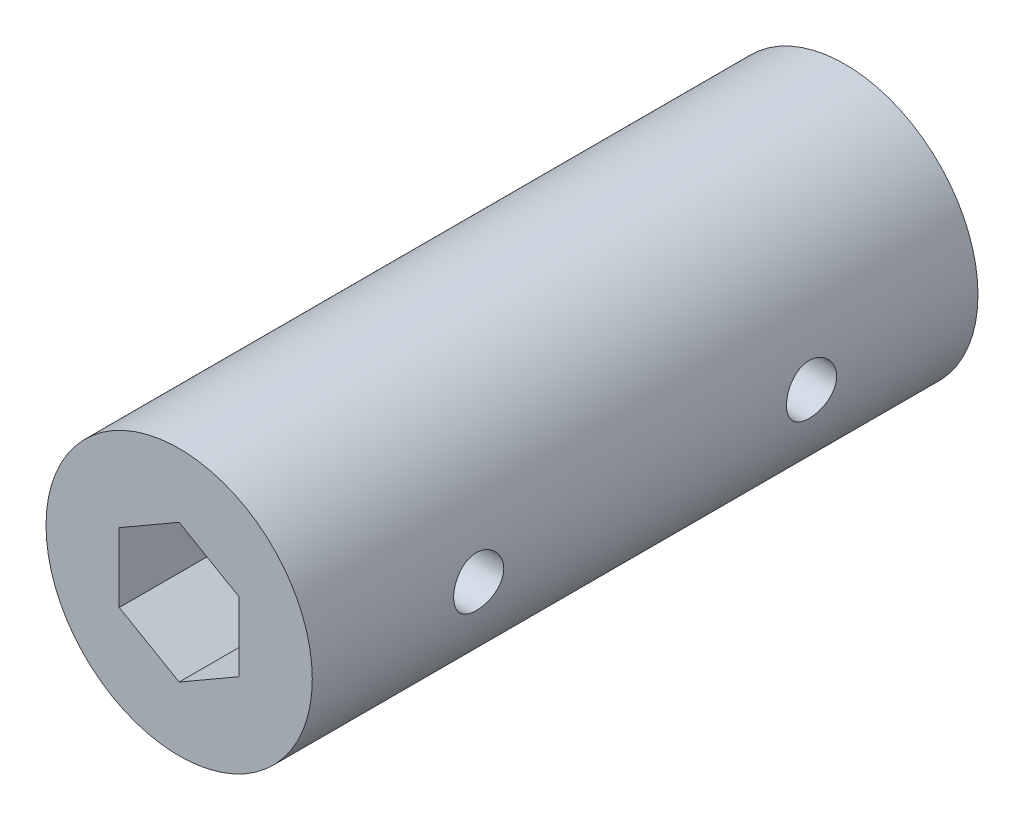
ISO-10303-21;
HEADER;
FILE_DESCRIPTION(('STEP AP214'),'2;1');
FILE_NAME('part.step','',(''),(''),'','','');
FILE_SCHEMA(('AUTOMOTIVE_DESIGN { 1 0 10303 214 1 1 1 1 }'));
ENDSEC;
DATA;
#1=APPLICATION_CONTEXT('core data for automotive mechanical design processes');
#2=APPLICATION_PROTOCOL_DEFINITION('international standard','automotive_design',2000,#1);
#3=PRODUCT_CONTEXT('',#1,'mechanical');
#4=PRODUCT('Part','Part','',(#3));
#5=PRODUCT_RELATED_PRODUCT_CATEGORY('part','',(#4));
#6=PRODUCT_DEFINITION_FORMATION('','',#4);
#7=PRODUCT_DEFINITION_CONTEXT('part definition',#1,'design');
#8=PRODUCT_DEFINITION('design','',#6,#7);
#9=PRODUCT_DEFINITION_SHAPE('','',#8);
#10=(LENGTH_UNIT() NAMED_UNIT(*) SI_UNIT(.MILLI.,.METRE.));
#11=(NAMED_UNIT(*) PLANE_ANGLE_UNIT() SI_UNIT($,.RADIAN.));
#12=(NAMED_UNIT(*) SI_UNIT($,.STERADIAN.) SOLID_ANGLE_UNIT());
#13=UNCERTAINTY_MEASURE_WITH_UNIT(LENGTH_MEASURE(1.E-05),#10,'distance_accuracy_value','');
#14=(GEOMETRIC_REPRESENTATION_CONTEXT(3) GLOBAL_UNCERTAINTY_ASSIGNED_CONTEXT((#13)) GLOBAL_UNIT_ASSIGNED_CONTEXT((#10,
#11,#12)) REPRESENTATION_CONTEXT('',''));
#15=CARTESIAN_POINT('',(0.,0.,0.));
#16=DIRECTION('',(0.,0.,1.));
#17=DIRECTION('',(1.,0.,0.));
#18=AXIS2_PLACEMENT_3D('',#15,#16,#17);
#19=CARTESIAN_POINT('',(0.,0.,5.));
#20=DIRECTION('',(0.,0.,-1.));
#21=DIRECTION('',(-1.,0.,0.));
#22=AXIS2_PLACEMENT_3D('',#19,#20,#21);
#23=CYLINDRICAL_SURFACE('',#22,2.);
#24=CARTESIAN_POINT('',(0.,0.,0.));
#25=DIRECTION('',(0.,0.,1.));
#26=DIRECTION('',(1.,0.,0.));
#27=AXIS2_PLACEMENT_3D('',#24,#25,#26);
#28=CIRCLE('',#27,2.);
#29=CARTESIAN_POINT('',(2.,0.,0.));
#30=VERTEX_POINT('',#29);
#31=EDGE_CURVE('E11',#30,#30,#28,.T.);
#32=ORIENTED_EDGE('',*,*,#31,.T.);
#33=EDGE_LOOP('',(#32));
#34=FACE_BOUND('',#33,.T.);
#35=CARTESIAN_POINT('',(0.,0.,10.));
#36=DIRECTION('',(0.,0.,1.));
#37=DIRECTION('',(1.,0.,0.));
#38=AXIS2_PLACEMENT_3D('',#35,#36,#37);
#39=CIRCLE('',#38,2.);
#40=CARTESIAN_POINT('',(2.,0.,10.));
#41=VERTEX_POINT('',#40);
#42=EDGE_CURVE('E124',#41,#41,#39,.T.);
#43=ORIENTED_EDGE('',*,*,#42,.F.);
#44=EDGE_LOOP('',(#43));
#45=FACE_BOUND('',#44,.T.);
#46=CARTESIAN_POINT('',(2.,0.,2.87626028684151));
#47=CARTESIAN_POINT('',(1.99999962039289,-0.0209367625480276,2.87625948819848));
#48=CARTESIAN_POINT('',(1.99966784556635,-0.0418839014974897,2.87450686265221));
#49=CARTESIAN_POINT('',(1.99837630978901,-0.0831878123205375,2.86754723321691));
#50=CARTESIAN_POINT('',(1.99741602037028,-0.103544072315264,2.8623373223203));
#51=CARTESIAN_POINT('',(1.99497486650046,-0.143062915599565,2.84862836451172));
#52=CARTESIAN_POINT('',(1.99349447369397,-0.162226561913329,2.84013229687842));
#53=CARTESIAN_POINT('',(1.99017473461044,-0.198854646049705,2.8201006734099));
#54=CARTESIAN_POINT('',(1.9883354170142,-0.216319219474129,2.80856536040765));
#55=CARTESIAN_POINT('',(1.98447602847143,-0.2492656376354,2.78263511718872));
#56=CARTESIAN_POINT('',(1.98245422062248,-0.264724043476439,2.76821066146334));
#57=CARTESIAN_POINT('',(1.97847060078653,-0.293016540922616,2.73697510074329));
#58=CARTESIAN_POINT('',(1.97650879313602,-0.305850443222121,2.72016382373509));
#59=CARTESIAN_POINT('',(1.97285040860545,-0.328627225200775,2.68446604315559));
#60=CARTESIAN_POINT('',(1.97115607091369,-0.338546241075054,2.66556406373147));
#61=CARTESIAN_POINT('',(1.96824894637511,-0.355058913423857,2.62632479094871));
#62=CARTESIAN_POINT('',(1.96703611770899,-0.361652858695814,2.6059876224177));
#63=CARTESIAN_POINT('',(1.96524681700218,-0.371252946306689,2.56470612841357));
#64=CARTESIAN_POINT('',(1.96466309863351,-0.374299976814944,2.54377163187558));
#65=CARTESIAN_POINT('',(1.96417626330727,-0.376846659652528,2.50168102870796));
#66=CARTESIAN_POINT('',(1.96427308489974,-0.376346632266626,2.48052494225926));
#67=CARTESIAN_POINT('',(1.96512979320003,-0.371846543616454,2.43888807754322));
#68=CARTESIAN_POINT('',(1.96588086779506,-0.367892995738783,2.41840206402529));
#69=CARTESIAN_POINT('',(1.96794761166039,-0.356671352662454,2.37838937599976));
#70=CARTESIAN_POINT('',(1.96926330506849,-0.349403115757998,2.35886274254602));
#71=CARTESIAN_POINT('',(1.97232024290914,-0.331712977302322,2.32118710864903));
#72=CARTESIAN_POINT('',(1.97406400721391,-0.321272311164376,2.30304713179403));
#73=CARTESIAN_POINT('',(1.97777894448408,-0.297546955887479,2.26875907030524));
#74=CARTESIAN_POINT('',(1.97975014066961,-0.284261976233793,2.25261118940746));
#75=CARTESIAN_POINT('',(1.98373622313679,-0.254974411715927,2.22249697468124));
#76=CARTESIAN_POINT('',(1.98575130634051,-0.238932046754916,2.20856932616257));
#77=CARTESIAN_POINT('',(1.98956937150571,-0.204718162776673,2.18359705729511));
#78=CARTESIAN_POINT('',(1.99137235131327,-0.186546622141195,2.17255246622266));
#79=CARTESIAN_POINT('',(1.99456673950287,-0.148549727803662,2.15365405605501));
#80=CARTESIAN_POINT('',(1.99595762576836,-0.128722316541228,2.14580428008127));
#81=CARTESIAN_POINT('',(1.99816708012385,-0.0879983191829346,2.13355754448554));
#82=CARTESIAN_POINT('',(1.99898570942611,-0.067101847697311,2.12916021556148));
#83=CARTESIAN_POINT('',(1.9999499986352,-0.0251657090771479,2.12399708955974));
#84=CARTESIAN_POINT('',(2.00010547962339,-0.00413278597796158,2.1231782907016));
#85=CARTESIAN_POINT('',(1.99975308989593,0.0377694303818246,2.12505326757363));
#86=CARTESIAN_POINT('',(1.9992452520005,0.058638731686834,2.1277468695145));
#87=CARTESIAN_POINT('',(1.99762940333821,0.0994530466740083,2.13652612311345));
#88=CARTESIAN_POINT('',(1.99652614295102,0.119404037574207,2.14258493755082));
#89=CARTESIAN_POINT('',(1.99384264963649,0.158007027938973,2.15789357274503));
#90=CARTESIAN_POINT('',(1.99226238415604,0.176658938641135,2.16714361129243));
#91=CARTESIAN_POINT('',(1.98877567395116,0.212360375756812,2.18868929934105));
#92=CARTESIAN_POINT('',(1.98686583450882,0.22939003316162,2.20101731139664));
#93=CARTESIAN_POINT('',(1.9829405489456,0.261157903449768,2.22832522942384));
#94=CARTESIAN_POINT('',(1.98092509290509,0.275895900580245,2.24330538480311));
#95=CARTESIAN_POINT('',(1.97698312162004,0.302863644236194,2.27573237154246));
#96=CARTESIAN_POINT('',(1.97505815633942,0.315057209781162,2.29320951249218));
#97=CARTESIAN_POINT('',(1.97154639789009,0.336335523458366,2.329995157251));
#98=CARTESIAN_POINT('',(1.96995959210275,0.345420387601356,2.34930359268536));
#99=CARTESIAN_POINT('',(1.96731599923769,0.360172211125904,2.38911217657844));
#100=CARTESIAN_POINT('',(1.9662566519945,0.365855707703081,2.40960601889913));
#101=CARTESIAN_POINT('',(1.96478209235627,0.373694420186654,2.45127955992188));
#102=CARTESIAN_POINT('',(1.96436680674177,0.375850037157831,2.47245918038246));
#103=CARTESIAN_POINT('',(1.96423112137788,0.376558310376111,2.51454060764416));
#104=CARTESIAN_POINT('',(1.96449971333679,0.37516804365189,2.53544143957459));
#105=CARTESIAN_POINT('',(1.96567710069419,0.368949024738867,2.57670579554992));
#106=CARTESIAN_POINT('',(1.96658589220669,0.364120293421386,2.59706932285545));
#107=CARTESIAN_POINT('',(1.96893663086479,0.351185565600027,2.63665004553619));
#108=CARTESIAN_POINT('',(1.97037756554365,0.343085789934165,2.65586933783949));
#109=CARTESIAN_POINT('',(1.9736309430097,0.323845154716836,2.6926852904405));
#110=CARTESIAN_POINT('',(1.97544341228481,0.312704078322222,2.71028183491743));
#111=CARTESIAN_POINT('',(1.97926978661065,0.287498835074759,2.74363861428152));
#112=CARTESIAN_POINT('',(1.98128631580646,0.273393145175225,2.75936717764843));
#113=CARTESIAN_POINT('',(1.98527400435217,0.24274562135947,2.78825311736238));
#114=CARTESIAN_POINT('',(1.98724515317347,0.226203228565631,2.80140990223587));
#115=CARTESIAN_POINT('',(1.99094096840375,0.190972036990707,2.82489038484039));
#116=CARTESIAN_POINT('',(1.99266323618528,0.172265125437854,2.83518729459973));
#117=CARTESIAN_POINT('',(1.99564380258688,0.133360409218152,2.85247559347386));
#118=CARTESIAN_POINT('',(1.99690253589355,0.113164022776603,2.8594700812317));
#119=CARTESIAN_POINT('',(1.99855817937103,0.077424133789161,2.86853803751634));
#120=CARTESIAN_POINT('',(1.99909580315138,0.0620893071506072,2.87142892129188));
#121=CARTESIAN_POINT('',(1.9998168502314,0.0311715668642417,2.87529031858009));
#122=CARTESIAN_POINT('',(2.00000028263997,0.0155886596068232,2.87626088147854));
#123=CARTESIAN_POINT('',(2.,0.,2.87626028684151));
#124=B_SPLINE_CURVE_WITH_KNOTS('',3,(#46,#47,#48,#49,#50,#51,#52,#53,#54,#55,#56,#57,#58,#59,
#60,#61,#62,#63,#64,#65,#66,#67,#68,#69,#70,#71,#72,#73,#74,#75,#76,#77,#78,#79,#80,#81,#82,#83,
#84,#85,#86,#87,#88,#89,#90,#91,#92,#93,#94,#95,#96,#97,#98,#99,#100,#101,#102,#103,#104,#105,
#106,#107,#108,#109,#110,#111,#112,#113,#114,#115,#116,#117,#118,#119,#120,#121,#122,#123),
.UNSPECIFIED.,.T.,.F.,(4,2,2,2,2,2,2,2,2,2,2,2,2,2,2,2,2,2,2,2,2,2,2,2,2,2,2,2,2,2,2,2,2,2,2,2,
2,2,4),(0.,0.0627532779438938,0.125559388030781,0.18830869012806,0.251052980132334,
0.314474598935464,0.377900790732321,0.441832635437187,0.505758926415122,0.568940751378427,
0.63211687135491,0.694455005913149,0.756795805729952,0.819512770026775,0.882236143216908,
0.945954871209005,1.00967424621512,1.07347401086331,1.13726695003475,1.20011177609492,
1.2629534927878,1.3253011034133,1.38765296990061,1.45069027010019,1.51373350148169,
1.5776198630834,1.64150384030895,1.70507464038883,1.76863821296003,1.83118510120659,
1.89373160979966,1.95615972408647,2.01859229062816,2.08196577063989,2.14535380857241,
2.20931697265943,2.27322000062776,2.31994473400741,2.36666826572993),.UNSPECIFIED.);
#125=CARTESIAN_POINT('',(2.,0.,2.87626028684151));
#126=VERTEX_POINT('',#125);
#127=EDGE_CURVE('E144',#126,#126,#124,.T.);
#128=ORIENTED_EDGE('',*,*,#127,.F.);
#129=EDGE_LOOP('',(#128));
#130=FACE_BOUND('',#129,.T.);
#131=CARTESIAN_POINT('',(2.,0.,7.87626028684151));
#132=CARTESIAN_POINT('',(1.99999962039289,-0.0209367625480279,7.87625948819848));
#133=CARTESIAN_POINT('',(1.99966784556635,-0.0418839014974899,7.87450686265221));
#134=CARTESIAN_POINT('',(1.99837630978901,-0.0831878123205376,7.86754723321691));
#135=CARTESIAN_POINT('',(1.99741602037028,-0.103544072315264,7.8623373223203));
#136=CARTESIAN_POINT('',(1.99497486650046,-0.143062915599565,7.84862836451172));
#137=CARTESIAN_POINT('',(1.99349447369397,-0.162226561913329,7.84013229687842));
#138=CARTESIAN_POINT('',(1.99017473461044,-0.198854646049705,7.8201006734099));
#139=CARTESIAN_POINT('',(1.9883354170142,-0.216319219474129,7.80856536040765));
#140=CARTESIAN_POINT('',(1.98447602847143,-0.2492656376354,7.78263511718872));
#141=CARTESIAN_POINT('',(1.98245422062248,-0.264724043476439,7.76821066146334));
#142=CARTESIAN_POINT('',(1.97847060078653,-0.293016540922616,7.73697510074329));
#143=CARTESIAN_POINT('',(1.97650879313602,-0.305850443222121,7.72016382373509));
#144=CARTESIAN_POINT('',(1.97285040860545,-0.328627225200775,7.68446604315559));
#145=CARTESIAN_POINT('',(1.97115607091369,-0.338546241075054,7.66556406373147));
#146=CARTESIAN_POINT('',(1.96824894637511,-0.355058913423857,7.62632479094871));
#147=CARTESIAN_POINT('',(1.96703611770899,-0.361652858695814,7.6059876224177));
#148=CARTESIAN_POINT('',(1.96524681700218,-0.371252946306689,7.56470612841358));
#149=CARTESIAN_POINT('',(1.96466309863351,-0.374299976814944,7.54377163187558));
#150=CARTESIAN_POINT('',(1.96417626330727,-0.376846659652528,7.50168102870796));
#151=CARTESIAN_POINT('',(1.96427308489974,-0.376346632266626,7.48052494225926));
#152=CARTESIAN_POINT('',(1.96512979320004,-0.371846543616454,7.43888807754322));
#153=CARTESIAN_POINT('',(1.96588086779506,-0.367892995738783,7.41840206402529));
#154=CARTESIAN_POINT('',(1.96794761166039,-0.356671352662454,7.37838937599976));
#155=CARTESIAN_POINT('',(1.96926330506849,-0.349403115757998,7.35886274254602));
#156=CARTESIAN_POINT('',(1.97232024290914,-0.331712977302323,7.32118710864903));
#157=CARTESIAN_POINT('',(1.97406400721391,-0.321272311164377,7.30304713179403));
#158=CARTESIAN_POINT('',(1.97777894448408,-0.29754695588748,7.26875907030524));
#159=CARTESIAN_POINT('',(1.97975014066961,-0.284261976233794,7.25261118940746));
#160=CARTESIAN_POINT('',(1.98373622313679,-0.254974411715928,7.22249697468124));
#161=CARTESIAN_POINT('',(1.98575130634051,-0.238932046754917,7.20856932616257));
#162=CARTESIAN_POINT('',(1.98956937150571,-0.204718162776674,7.18359705729511));
#163=CARTESIAN_POINT('',(1.99137235131327,-0.186546622141196,7.17255246622266));
#164=CARTESIAN_POINT('',(1.99456673950287,-0.148549727803662,7.15365405605501));
#165=CARTESIAN_POINT('',(1.99595762576836,-0.128722316541229,7.14580428008127));
#166=CARTESIAN_POINT('',(1.99816708012385,-0.0879983191829354,7.13355754448554));
#167=CARTESIAN_POINT('',(1.99898570942611,-0.0671018476973119,7.12916021556148));
#168=CARTESIAN_POINT('',(1.9999499986352,-0.0251657090771487,7.12399708955974));
#169=CARTESIAN_POINT('',(2.00010547962339,-0.00413278597796232,7.1231782907016));
#170=CARTESIAN_POINT('',(1.99975308989593,0.0377694303818237,7.12505326757363));
#171=CARTESIAN_POINT('',(1.9992452520005,0.0586387316868331,7.1277468695145));
#172=CARTESIAN_POINT('',(1.99762940333821,0.0994530466740073,7.13652612311345));
#173=CARTESIAN_POINT('',(1.99652614295102,0.119404037574206,7.14258493755082));
#174=CARTESIAN_POINT('',(1.99384264963649,0.158007027938972,7.15789357274503));
#175=CARTESIAN_POINT('',(1.99226238415604,0.176658938641134,7.16714361129243));
#176=CARTESIAN_POINT('',(1.98877567395116,0.212360375756812,7.18868929934105));
#177=CARTESIAN_POINT('',(1.98686583450882,0.22939003316162,7.20101731139664));
#178=CARTESIAN_POINT('',(1.9829405489456,0.261157903449767,7.22832522942384));
#179=CARTESIAN_POINT('',(1.98092509290509,0.275895900580244,7.24330538480311));
#180=CARTESIAN_POINT('',(1.97698312162004,0.302863644236193,7.27573237154246));
#181=CARTESIAN_POINT('',(1.97505815633942,0.315057209781161,7.29320951249218));
#182=CARTESIAN_POINT('',(1.97154639789009,0.336335523458365,7.329995157251));
#183=CARTESIAN_POINT('',(1.96995959210275,0.345420387601355,7.34930359268536));
#184=CARTESIAN_POINT('',(1.96731599923769,0.360172211125903,7.38911217657844));
#185=CARTESIAN_POINT('',(1.9662566519945,0.36585570770308,7.40960601889913));
#186=CARTESIAN_POINT('',(1.96478209235627,0.373694420186654,7.45127955992188));
#187=CARTESIAN_POINT('',(1.96436680674177,0.375850037157831,7.47245918038246));
#188=CARTESIAN_POINT('',(1.96423112137788,0.376558310376111,7.51454060764416));
#189=CARTESIAN_POINT('',(1.96449971333679,0.37516804365189,7.53544143957459));
#190=CARTESIAN_POINT('',(1.96567710069419,0.368949024738867,7.57670579554992));
#191=CARTESIAN_POINT('',(1.96658589220669,0.364120293421386,7.59706932285545));
#192=CARTESIAN_POINT('',(1.96893663086479,0.351185565600026,7.63665004553619));
#193=CARTESIAN_POINT('',(1.97037756554365,0.343085789934164,7.65586933783949));
#194=CARTESIAN_POINT('',(1.9736309430097,0.323845154716835,7.6926852904405));
#195=CARTESIAN_POINT('',(1.97544341228481,0.312704078322222,7.71028183491743));
#196=CARTESIAN_POINT('',(1.97926978661065,0.287498835074759,7.74363861428152));
#197=CARTESIAN_POINT('',(1.98128631580646,0.273393145175225,7.75936717764843));
#198=CARTESIAN_POINT('',(1.98527400435217,0.242745621359469,7.78825311736238));
#199=CARTESIAN_POINT('',(1.98724515317347,0.226203228565631,7.80140990223587));
#200=CARTESIAN_POINT('',(1.99094096840375,0.190972036990707,7.82489038484039));
#201=CARTESIAN_POINT('',(1.99266323618528,0.172265125437854,7.83518729459973));
#202=CARTESIAN_POINT('',(1.99564380258688,0.133360409218152,7.85247559347386));
#203=CARTESIAN_POINT('',(1.99690253589355,0.113164022776603,7.8594700812317));
#204=CARTESIAN_POINT('',(1.99855817937103,0.0774241337891609,7.86853803751634));
#205=CARTESIAN_POINT('',(1.99909580315138,0.062089307150607,7.87142892129188));
#206=CARTESIAN_POINT('',(1.99981685023139,0.0311715668642413,7.87529031858009));
#207=CARTESIAN_POINT('',(2.00000028263997,0.0155886596068229,7.87626088147854));
#208=CARTESIAN_POINT('',(2.,0.,7.87626028684151));
#209=B_SPLINE_CURVE_WITH_KNOTS('',3,(#131,#132,#133,#134,#135,#136,#137,#138,#139,#140,#141,
#142,#143,#144,#145,#146,#147,#148,#149,#150,#151,#152,#153,#154,#155,#156,#157,#158,#159,#160,
#161,#162,#163,#164,#165,#166,#167,#168,#169,#170,#171,#172,#173,#174,#175,#176,#177,#178,#179,
#180,#181,#182,#183,#184,#185,#186,#187,#188,#189,#190,#191,#192,#193,#194,#195,#196,#197,#198,
#199,#200,#201,#202,#203,#204,#205,#206,#207,#208),.UNSPECIFIED.,.T.,.F.,(4,2,2,2,2,2,2,2,2,2,2,
2,2,2,2,2,2,2,2,2,2,2,2,2,2,2,2,2,2,2,2,2,2,2,2,2,2,2,4),(0.,0.0627532779438937,
0.125559388030781,0.18830869012806,0.251052980132334,0.314474598935464,0.377900790732321,
0.441832635437185,0.50575892641512,0.568940751378426,0.63211687135491,0.694455005913148,
0.756795805729951,0.819512770026774,0.882236143216907,0.945954871209004,1.00967424621512,
1.07347401086331,1.13726695003475,1.20011177609492,1.2629534927878,1.3253011034133,
1.38765296990061,1.45069027010019,1.51373350148169,1.5776198630834,1.64150384030895,
1.70507464038883,1.76863821296003,1.83118510120659,1.89373160979966,1.95615972408647,
2.01859229062816,2.08196577063989,2.14535380857241,2.20931697265943,2.27322000062776,
2.31994473400741,2.36666826572993),.UNSPECIFIED.);
#210=CARTESIAN_POINT('',(2.,0.,7.87626028684151));
#211=VERTEX_POINT('',#210);
#212=EDGE_CURVE('E179',#211,#211,#209,.T.);
#213=ORIENTED_EDGE('',*,*,#212,.F.);
#214=EDGE_LOOP('',(#213));
#215=FACE_BOUND('',#214,.T.);
#216=ADVANCED_FACE('F36',(#34,#45,#130,#215),#23,.T.);
#217=CARTESIAN_POINT('',(0.,0.,0.));
#218=DIRECTION('',(0.,0.,1.));
#219=DIRECTION('',(1.,0.,0.));
#220=AXIS2_PLACEMENT_3D('',#217,#218,#219);
#221=PLANE('',#220);
#222=ORIENTED_EDGE('',*,*,#31,.F.);
#223=EDGE_LOOP('',(#222));
#224=FACE_BOUND('',#223,.T.);
#225=CARTESIAN_POINT('',(0.,0.,0.));
#226=DIRECTION('',(0.,0.,1.));
#227=DIRECTION('',(1.,0.,0.));
#228=AXIS2_PLACEMENT_3D('',#225,#226,#227);
#229=CIRCLE('',#228,1.45);
#230=CARTESIAN_POINT('',(1.,1.05,0.));
#231=VERTEX_POINT('',#230);
#232=CARTESIAN_POINT('',(1.,-1.05,0.));
#233=VERTEX_POINT('',#232);
#234=EDGE_CURVE('E60',#231,#233,#229,.T.);
#235=ORIENTED_EDGE('',*,*,#234,.T.);
#236=DIRECTION('',(0.,1.,0.));
#237=VECTOR('',#236,1.);
#238=CARTESIAN_POINT('',(1.,1.05,0.));
#239=LINE('',#238,#237);
#240=EDGE_CURVE('E170',#233,#231,#239,.T.);
#241=ORIENTED_EDGE('',*,*,#240,.T.);
#242=EDGE_LOOP('',(#235,#241));
#243=FACE_BOUND('',#242,.T.);
#244=ADVANCED_FACE('F236',(#224,#243),#221,.F.);
#245=CARTESIAN_POINT('',(0.,0.,5.));
#246=DIRECTION('',(0.,0.,-1.));
#247=DIRECTION('',(-1.,0.,0.));
#248=AXIS2_PLACEMENT_3D('',#245,#246,#247);
#249=CYLINDRICAL_SURFACE('',#248,1.45);
#250=ORIENTED_EDGE('',*,*,#234,.F.);
#251=DIRECTION('',(0.,0.,-1.));
#252=VECTOR('',#251,1.);
#253=CARTESIAN_POINT('',(1.,1.05,5.));
#254=LINE('',#253,#252);
#255=CARTESIAN_POINT('',(1.,1.05,5.));
#256=VERTEX_POINT('',#255);
#257=EDGE_CURVE('E172',#256,#231,#254,.T.);
#258=ORIENTED_EDGE('',*,*,#257,.F.);
#259=CARTESIAN_POINT('',(0.,0.,5.));
#260=DIRECTION('',(0.,0.,1.));
#261=DIRECTION('',(1.,0.,0.));
#262=AXIS2_PLACEMENT_3D('',#259,#260,#261);
#263=CIRCLE('',#262,1.45);
#264=CARTESIAN_POINT('',(1.,-1.05,5.));
#265=VERTEX_POINT('',#264);
#266=EDGE_CURVE('E167',#256,#265,#263,.T.);
#267=ORIENTED_EDGE('',*,*,#266,.T.);
#268=DIRECTION('',(0.,0.,-1.));
#269=VECTOR('',#268,1.);
#270=CARTESIAN_POINT('',(1.,-1.05,5.));
#271=LINE('',#270,#269);
#272=EDGE_CURVE('E45',#265,#233,#271,.T.);
#273=ORIENTED_EDGE('',*,*,#272,.T.);
#274=EDGE_LOOP('',(#250,#258,#267,#273));
#275=FACE_BOUND('',#274,.T.);
#276=ADVANCED_FACE('F233',(#275),#249,.F.);
#277=CARTESIAN_POINT('',(1.,1.05,5.));
#278=DIRECTION('',(-1.,0.,0.));
#279=DIRECTION('',(0.,0.,1.));
#280=AXIS2_PLACEMENT_3D('',#277,#278,#279);
#281=PLANE('',#280);
#282=CARTESIAN_POINT('',(1.,0.,2.5));
#283=DIRECTION('',(-1.,0.,0.));
#284=DIRECTION('',(0.,0.,1.));
#285=AXIS2_PLACEMENT_3D('',#282,#283,#284);
#286=CIRCLE('',#285,0.376260286841509);
#287=CARTESIAN_POINT('',(1.,0.,2.87626028684151));
#288=VERTEX_POINT('',#287);
#289=EDGE_CURVE('E40',#288,#288,#286,.F.);
#290=ORIENTED_EDGE('',*,*,#289,.T.);
#291=EDGE_LOOP('',(#290));
#292=FACE_BOUND('',#291,.T.);
#293=ORIENTED_EDGE('',*,*,#240,.F.);
#294=ORIENTED_EDGE('',*,*,#272,.F.);
#295=DIRECTION('',(0.,1.,0.));
#296=VECTOR('',#295,1.);
#297=CARTESIAN_POINT('',(1.,1.05,5.));
#298=LINE('',#297,#296);
#299=EDGE_CURVE('E52',#265,#256,#298,.T.);
#300=ORIENTED_EDGE('',*,*,#299,.T.);
#301=ORIENTED_EDGE('',*,*,#257,.T.);
#302=EDGE_LOOP('',(#293,#294,#300,#301));
#303=FACE_BOUND('',#302,.T.);
#304=ADVANCED_FACE('F229',(#292,#303),#281,.T.);
#305=CARTESIAN_POINT('',(0.,0.,5.));
#306=DIRECTION('',(0.,0.,1.));
#307=DIRECTION('',(1.,0.,0.));
#308=AXIS2_PLACEMENT_3D('',#305,#306,#307);
#309=PLANE('',#308);
#310=DIRECTION('',(0.866025403784438,-0.5,0.));
#311=VECTOR('',#310,1.);
#312=CARTESIAN_POINT('',(-0.9,-0.519615242270663,5.));
#313=LINE('',#312,#311);
#314=CARTESIAN_POINT('',(-0.9,-0.519615242270663,5.));
#315=VERTEX_POINT('',#314);
#316=CARTESIAN_POINT('',(0.,-1.03923048454133,5.));
#317=VERTEX_POINT('',#316);
#318=EDGE_CURVE('E142',#315,#317,#313,.T.);
#319=ORIENTED_EDGE('',*,*,#318,.T.);
#320=DIRECTION('',(0.866025403784439,0.5,0.));
#321=VECTOR('',#320,1.);
#322=CARTESIAN_POINT('',(0.,-1.03923048454133,5.));
#323=LINE('',#322,#321);
#324=CARTESIAN_POINT('',(0.9,-0.519615242270664,5.));
#325=VERTEX_POINT('',#324);
#326=EDGE_CURVE('E123',#317,#325,#323,.T.);
#327=ORIENTED_EDGE('',*,*,#326,.T.);
#328=DIRECTION('',(0.,1.,0.));
#329=VECTOR('',#328,1.);
#330=CARTESIAN_POINT('',(0.9,-0.519615242270664,5.));
#331=LINE('',#330,#329);
#332=CARTESIAN_POINT('',(0.9,0.519615242270664,5.));
#333=VERTEX_POINT('',#332);
#334=EDGE_CURVE('E146',#325,#333,#331,.T.);
#335=ORIENTED_EDGE('',*,*,#334,.T.);
#336=DIRECTION('',(-0.866025403784439,0.5,0.));
#337=VECTOR('',#336,1.);
#338=CARTESIAN_POINT('',(0.9,0.519615242270664,5.));
#339=LINE('',#338,#337);
#340=CARTESIAN_POINT('',(0.,1.03923048454133,5.));
#341=VERTEX_POINT('',#340);
#342=EDGE_CURVE('E149',#333,#341,#339,.T.);
#343=ORIENTED_EDGE('',*,*,#342,.T.);
#344=DIRECTION('',(-0.866025403784439,-0.5,0.));
#345=VECTOR('',#344,1.);
#346=CARTESIAN_POINT('',(0.,1.03923048454133,5.));
#347=LINE('',#346,#345);
#348=CARTESIAN_POINT('',(-0.9,0.519615242270663,5.));
#349=VERTEX_POINT('',#348);
#350=EDGE_CURVE('E152',#341,#349,#347,.T.);
#351=ORIENTED_EDGE('',*,*,#350,.T.);
#352=DIRECTION('',(0.,-1.,0.));
#353=VECTOR('',#352,1.);
#354=CARTESIAN_POINT('',(-0.9,0.519615242270663,5.));
#355=LINE('',#354,#353);
#356=EDGE_CURVE('E117',#349,#315,#355,.T.);
#357=ORIENTED_EDGE('',*,*,#356,.T.);
#358=EDGE_LOOP('',(#319,#327,#335,#343,#351,#357));
#359=FACE_BOUND('',#358,.T.);
#360=ORIENTED_EDGE('',*,*,#299,.F.);
#361=ORIENTED_EDGE('',*,*,#266,.F.);
#362=EDGE_LOOP('',(#360,#361));
#363=FACE_BOUND('',#362,.T.);
#364=ADVANCED_FACE('F225',(#359,#363),#309,.F.);
#365=CARTESIAN_POINT('',(0.,0.,10.));
#366=DIRECTION('',(0.,0.,1.));
#367=DIRECTION('',(1.,0.,0.));
#368=AXIS2_PLACEMENT_3D('',#365,#366,#367);
#369=PLANE('',#368);
#370=ORIENTED_EDGE('',*,*,#42,.T.);
#371=EDGE_LOOP('',(#370));
#372=FACE_BOUND('',#371,.T.);
#373=DIRECTION('',(0.866025403784439,0.5,0.));
#374=VECTOR('',#373,1.);
#375=CARTESIAN_POINT('',(0.,-1.03923048454133,10.));
#376=LINE('',#375,#374);
#377=CARTESIAN_POINT('',(0.,-1.03923048454133,10.));
#378=VERTEX_POINT('',#377);
#379=CARTESIAN_POINT('',(0.9,-0.519615242270664,10.));
#380=VERTEX_POINT('',#379);
#381=EDGE_CURVE('E116',#378,#380,#376,.T.);
#382=ORIENTED_EDGE('',*,*,#381,.F.);
#383=DIRECTION('',(0.866025403784438,-0.5,0.));
#384=VECTOR('',#383,1.);
#385=CARTESIAN_POINT('',(-0.9,-0.519615242270663,10.));
#386=LINE('',#385,#384);
#387=CARTESIAN_POINT('',(-0.9,-0.519615242270663,10.));
#388=VERTEX_POINT('',#387);
#389=EDGE_CURVE('E106',#388,#378,#386,.T.);
#390=ORIENTED_EDGE('',*,*,#389,.F.);
#391=DIRECTION('',(0.,-1.,0.));
#392=VECTOR('',#391,1.);
#393=CARTESIAN_POINT('',(-0.9,0.519615242270663,10.));
#394=LINE('',#393,#392);
#395=CARTESIAN_POINT('',(-0.9,0.519615242270663,10.));
#396=VERTEX_POINT('',#395);
#397=EDGE_CURVE('E140',#396,#388,#394,.T.);
#398=ORIENTED_EDGE('',*,*,#397,.F.);
#399=DIRECTION('',(-0.866025403784439,-0.5,0.));
#400=VECTOR('',#399,1.);
#401=CARTESIAN_POINT('',(0.,1.03923048454133,10.));
#402=LINE('',#401,#400);
#403=CARTESIAN_POINT('',(0.,1.03923048454133,10.));
#404=VERTEX_POINT('',#403);
#405=EDGE_CURVE('E137',#404,#396,#402,.T.);
#406=ORIENTED_EDGE('',*,*,#405,.F.);
#407=DIRECTION('',(-0.866025403784439,0.5,0.));
#408=VECTOR('',#407,1.);
#409=CARTESIAN_POINT('',(0.9,0.519615242270664,10.));
#410=LINE('',#409,#408);
#411=CARTESIAN_POINT('',(0.9,0.519615242270664,10.));
#412=VERTEX_POINT('',#411);
#413=EDGE_CURVE('E132',#412,#404,#410,.T.);
#414=ORIENTED_EDGE('',*,*,#413,.F.);
#415=DIRECTION('',(0.,1.,0.));
#416=VECTOR('',#415,1.);
#417=CARTESIAN_POINT('',(0.9,-0.519615242270664,10.));
#418=LINE('',#417,#416);
#419=EDGE_CURVE('E130',#380,#412,#418,.T.);
#420=ORIENTED_EDGE('',*,*,#419,.F.);
#421=EDGE_LOOP('',(#382,#390,#398,#406,#414,#420));
#422=FACE_BOUND('',#421,.T.);
#423=ADVANCED_FACE('F128',(#372,#422),#369,.T.);
#424=CARTESIAN_POINT('',(-0.9,-0.519615242270663,10.));
#425=DIRECTION('',(0.5,0.866025403784439,0.));
#426=DIRECTION('',(-0.866025403784439,0.5,0.));
#427=AXIS2_PLACEMENT_3D('',#424,#425,#426);
#428=PLANE('',#427);
#429=ORIENTED_EDGE('',*,*,#318,.F.);
#430=DIRECTION('',(0.,0.,-1.));
#431=VECTOR('',#430,1.);
#432=CARTESIAN_POINT('',(-0.9,-0.519615242270663,10.));
#433=LINE('',#432,#431);
#434=EDGE_CURVE('E112',#388,#315,#433,.T.);
#435=ORIENTED_EDGE('',*,*,#434,.F.);
#436=ORIENTED_EDGE('',*,*,#389,.T.);
#437=DIRECTION('',(0.,0.,-1.));
#438=VECTOR('',#437,1.);
#439=CARTESIAN_POINT('',(0.,-1.03923048454133,10.));
#440=LINE('',#439,#438);
#441=EDGE_CURVE('E109',#378,#317,#440,.T.);
#442=ORIENTED_EDGE('',*,*,#441,.T.);
#443=EDGE_LOOP('',(#429,#435,#436,#442));
#444=FACE_BOUND('',#443,.T.);
#445=ADVANCED_FACE('F108',(#444),#428,.T.);
#446=CARTESIAN_POINT('',(0.,-1.03923048454133,10.));
#447=DIRECTION('',(-0.5,0.866025403784439,0.));
#448=DIRECTION('',(-0.866025403784439,-0.5,0.));
#449=AXIS2_PLACEMENT_3D('',#446,#447,#448);
#450=PLANE('',#449);
#451=ORIENTED_EDGE('',*,*,#326,.F.);
#452=ORIENTED_EDGE('',*,*,#441,.F.);
#453=ORIENTED_EDGE('',*,*,#381,.T.);
#454=DIRECTION('',(0.,0.,-1.));
#455=VECTOR('',#454,1.);
#456=CARTESIAN_POINT('',(0.9,-0.519615242270664,10.));
#457=LINE('',#456,#455);
#458=EDGE_CURVE('E125',#380,#325,#457,.T.);
#459=ORIENTED_EDGE('',*,*,#458,.T.);
#460=EDGE_LOOP('',(#451,#452,#453,#459));
#461=FACE_BOUND('',#460,.T.);
#462=ADVANCED_FACE('F120',(#461),#450,.T.);
#463=CARTESIAN_POINT('',(0.9,-0.519615242270664,10.));
#464=DIRECTION('',(-1.,0.,0.));
#465=DIRECTION('',(0.,-1.,0.));
#466=AXIS2_PLACEMENT_3D('',#463,#464,#465);
#467=PLANE('',#466);
#468=CARTESIAN_POINT('',(0.9,0.,7.5));
#469=DIRECTION('',(-1.,0.,0.));
#470=DIRECTION('',(0.,-1.,0.));
#471=AXIS2_PLACEMENT_3D('',#468,#469,#470);
#472=CIRCLE('',#471,0.376260286841509);
#473=CARTESIAN_POINT('',(0.9,-0.376260286841509,7.5));
#474=VERTEX_POINT('',#473);
#475=EDGE_CURVE('E177',#474,#474,#472,.F.);
#476=ORIENTED_EDGE('',*,*,#475,.T.);
#477=EDGE_LOOP('',(#476));
#478=FACE_BOUND('',#477,.T.);
#479=ORIENTED_EDGE('',*,*,#334,.F.);
#480=ORIENTED_EDGE('',*,*,#458,.F.);
#481=ORIENTED_EDGE('',*,*,#419,.T.);
#482=DIRECTION('',(0.,0.,-1.));
#483=VECTOR('',#482,1.);
#484=CARTESIAN_POINT('',(0.9,0.519615242270664,10.));
#485=LINE('',#484,#483);
#486=EDGE_CURVE('E162',#412,#333,#485,.T.);
#487=ORIENTED_EDGE('',*,*,#486,.T.);
#488=EDGE_LOOP('',(#479,#480,#481,#487));
#489=FACE_BOUND('',#488,.T.);
#490=ADVANCED_FACE('F215',(#478,#489),#467,.T.);
#491=CARTESIAN_POINT('',(0.9,0.519615242270664,10.));
#492=DIRECTION('',(-0.5,-0.866025403784439,0.));
#493=DIRECTION('',(0.866025403784439,-0.5,0.));
#494=AXIS2_PLACEMENT_3D('',#491,#492,#493);
#495=PLANE('',#494);
#496=ORIENTED_EDGE('',*,*,#342,.F.);
#497=ORIENTED_EDGE('',*,*,#486,.F.);
#498=ORIENTED_EDGE('',*,*,#413,.T.);
#499=DIRECTION('',(0.,0.,-1.));
#500=VECTOR('',#499,1.);
#501=CARTESIAN_POINT('',(0.,1.03923048454133,10.));
#502=LINE('',#501,#500);
#503=EDGE_CURVE('E160',#404,#341,#502,.T.);
#504=ORIENTED_EDGE('',*,*,#503,.T.);
#505=EDGE_LOOP('',(#496,#497,#498,#504));
#506=FACE_BOUND('',#505,.T.);
#507=ADVANCED_FACE('F211',(#506),#495,.T.);
#508=CARTESIAN_POINT('',(0.,1.03923048454133,10.));
#509=DIRECTION('',(0.5,-0.866025403784439,0.));
#510=DIRECTION('',(0.866025403784439,0.5,0.));
#511=AXIS2_PLACEMENT_3D('',#508,#509,#510);
#512=PLANE('',#511);
#513=ORIENTED_EDGE('',*,*,#350,.F.);
#514=ORIENTED_EDGE('',*,*,#503,.F.);
#515=ORIENTED_EDGE('',*,*,#405,.T.);
#516=DIRECTION('',(0.,0.,-1.));
#517=VECTOR('',#516,1.);
#518=CARTESIAN_POINT('',(-0.9,0.519615242270663,10.));
#519=LINE('',#518,#517);
#520=EDGE_CURVE('E158',#396,#349,#519,.T.);
#521=ORIENTED_EDGE('',*,*,#520,.T.);
#522=EDGE_LOOP('',(#513,#514,#515,#521));
#523=FACE_BOUND('',#522,.T.);
#524=ADVANCED_FACE('F207',(#523),#512,.T.);
#525=CARTESIAN_POINT('',(-0.9,0.519615242270663,10.));
#526=DIRECTION('',(1.,0.,0.));
#527=DIRECTION('',(0.,1.,0.));
#528=AXIS2_PLACEMENT_3D('',#525,#526,#527);
#529=PLANE('',#528);
#530=ORIENTED_EDGE('',*,*,#356,.F.);
#531=ORIENTED_EDGE('',*,*,#520,.F.);
#532=ORIENTED_EDGE('',*,*,#397,.T.);
#533=ORIENTED_EDGE('',*,*,#434,.T.);
#534=EDGE_LOOP('',(#530,#531,#532,#533));
#535=FACE_BOUND('',#534,.T.);
#536=ADVANCED_FACE('F199',(#535),#529,.T.);
#537=CARTESIAN_POINT('',(2.,0.,7.5));
#538=DIRECTION('',(-1.,0.,0.));
#539=DIRECTION('',(0.,0.,1.));
#540=AXIS2_PLACEMENT_3D('',#537,#538,#539);
#541=CYLINDRICAL_SURFACE('',#540,0.376260286841509);
#542=ORIENTED_EDGE('',*,*,#475,.F.);
#543=EDGE_LOOP('',(#542));
#544=FACE_BOUND('',#543,.T.);
#545=ORIENTED_EDGE('',*,*,#212,.T.);
#546=EDGE_LOOP('',(#545));
#547=FACE_BOUND('',#546,.T.);
#548=ADVANCED_FACE('F195',(#544,#547),#541,.F.);
#549=CARTESIAN_POINT('',(2.,0.,2.5));
#550=DIRECTION('',(-1.,0.,0.));
#551=DIRECTION('',(0.,0.,1.));
#552=AXIS2_PLACEMENT_3D('',#549,#550,#551);
#553=CYLINDRICAL_SURFACE('',#552,0.376260286841509);
#554=ORIENTED_EDGE('',*,*,#289,.F.);
#555=EDGE_LOOP('',(#554));
#556=FACE_BOUND('',#555,.T.);
#557=ORIENTED_EDGE('',*,*,#127,.T.);
#558=EDGE_LOOP('',(#557));
#559=FACE_BOUND('',#558,.T.);
#560=ADVANCED_FACE('F198',(#556,#559),#553,.F.);
#561=CLOSED_SHELL('',(#216,#244,#276,#304,#364,#423,#445,#462,#490,#507,#524,#536,#548,#560));
#562=MANIFOLD_SOLID_BREP('B2',#561);
#563=ADVANCED_BREP_SHAPE_REPRESENTATION('',(#18,#562),#14);
#564=SHAPE_DEFINITION_REPRESENTATION(#9,#563);
ENDSEC;
END-ISO-10303-21;
